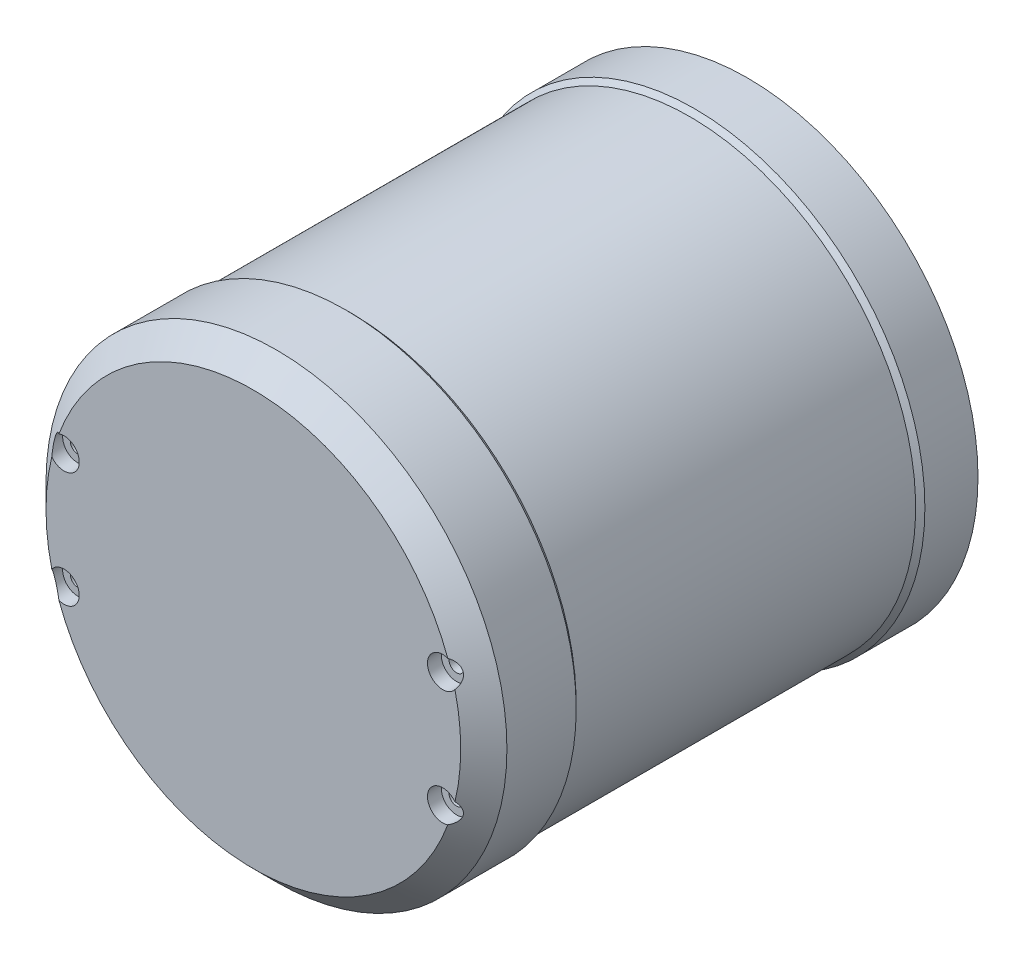
ISO-10303-21;
HEADER;
FILE_DESCRIPTION(('STEP AP214'),'2;1');
FILE_NAME('part.step','',(''),(''),'','','');
FILE_SCHEMA(('AUTOMOTIVE_DESIGN { 1 0 10303 214 1 1 1 1 }'));
ENDSEC;
DATA;
#1=APPLICATION_CONTEXT('core data for automotive mechanical design processes');
#2=APPLICATION_PROTOCOL_DEFINITION('international standard','automotive_design',2000,#1);
#3=PRODUCT_CONTEXT('',#1,'mechanical');
#4=PRODUCT('Part','Part','',(#3));
#5=PRODUCT_RELATED_PRODUCT_CATEGORY('part','',(#4));
#6=PRODUCT_DEFINITION_FORMATION('','',#4);
#7=PRODUCT_DEFINITION_CONTEXT('part definition',#1,'design');
#8=PRODUCT_DEFINITION('design','',#6,#7);
#9=PRODUCT_DEFINITION_SHAPE('','',#8);
#10=(LENGTH_UNIT() NAMED_UNIT(*) SI_UNIT(.MILLI.,.METRE.));
#11=(NAMED_UNIT(*) PLANE_ANGLE_UNIT() SI_UNIT($,.RADIAN.));
#12=(NAMED_UNIT(*) SI_UNIT($,.STERADIAN.) SOLID_ANGLE_UNIT());
#13=UNCERTAINTY_MEASURE_WITH_UNIT(LENGTH_MEASURE(1.E-05),#10,'distance_accuracy_value','');
#14=(GEOMETRIC_REPRESENTATION_CONTEXT(3) GLOBAL_UNCERTAINTY_ASSIGNED_CONTEXT((#13)) GLOBAL_UNIT_ASSIGNED_CONTEXT((#10,
#11,#12)) REPRESENTATION_CONTEXT('',''));
#15=CARTESIAN_POINT('',(0.,0.,0.));
#16=DIRECTION('',(0.,0.,1.));
#17=DIRECTION('',(1.,0.,0.));
#18=AXIS2_PLACEMENT_3D('',#15,#16,#17);
#19=CARTESIAN_POINT('',(3.10934870199998E-13,55.,-241.138513524835));
#20=DIRECTION('',(0.,0.,1.));
#21=DIRECTION('',(1.,0.,0.));
#22=AXIS2_PLACEMENT_3D('',#19,#20,#21);
#23=CYLINDRICAL_SURFACE('',#22,49.9);
#24=CARTESIAN_POINT('',(0.,55.,-13.));
#25=DIRECTION('',(0.,0.,-1.));
#26=DIRECTION('',(-1.,0.,0.));
#27=AXIS2_PLACEMENT_3D('',#24,#25,#26);
#28=CIRCLE('',#27,49.9);
#29=CARTESIAN_POINT('',(-49.9,55.,-13.));
#30=VERTEX_POINT('',#29);
#31=EDGE_CURVE('E183',#30,#30,#28,.T.);
#32=ORIENTED_EDGE('',*,*,#31,.F.);
#33=EDGE_LOOP('',(#32));
#34=FACE_BOUND('',#33,.T.);
#35=CARTESIAN_POINT('',(3.10934870199998E-13,55.,1.99999999999997));
#36=DIRECTION('',(0.,0.,1.));
#37=DIRECTION('',(1.,0.,0.));
#38=AXIS2_PLACEMENT_3D('',#35,#36,#37);
#39=CIRCLE('',#38,49.9);
#40=CARTESIAN_POINT('',(49.9000000000003,55.,1.99999999999997));
#41=VERTEX_POINT('',#40);
#42=EDGE_CURVE('E299',#41,#41,#39,.F.);
#43=ORIENTED_EDGE('',*,*,#42,.T.);
#44=EDGE_LOOP('',(#43));
#45=FACE_BOUND('',#44,.T.);
#46=ADVANCED_FACE('F41',(#34,#45),#23,.T.);
#47=CARTESIAN_POINT('',(41.0000000000002,67.5,7.));
#48=DIRECTION('',(0.,0.,-1.));
#49=DIRECTION('',(-1.,0.,0.));
#50=AXIS2_PLACEMENT_3D('',#47,#48,#49);
#51=CYLINDRICAL_SURFACE('',#50,1.65);
#52=CARTESIAN_POINT('',(41.0000000000002,67.5,0.));
#53=DIRECTION('',(0.,0.,1.));
#54=DIRECTION('',(1.,0.,0.));
#55=AXIS2_PLACEMENT_3D('',#52,#53,#54);
#56=CIRCLE('',#55,1.65);
#57=CARTESIAN_POINT('',(42.6500000000002,67.5,0.));
#58=VERTEX_POINT('',#57);
#59=EDGE_CURVE('E221',#58,#58,#56,.T.);
#60=ORIENTED_EDGE('',*,*,#59,.F.);
#61=EDGE_LOOP('',(#60));
#62=FACE_BOUND('',#61,.T.);
#63=CARTESIAN_POINT('',(41.0000000000002,67.5,4.));
#64=DIRECTION('',(0.,0.,1.));
#65=DIRECTION('',(1.,0.,0.));
#66=AXIS2_PLACEMENT_3D('',#63,#64,#65);
#67=CIRCLE('',#66,1.65);
#68=CARTESIAN_POINT('',(42.6500000000002,67.5,4.));
#69=VERTEX_POINT('',#68);
#70=EDGE_CURVE('E215',#69,#69,#67,.T.);
#71=ORIENTED_EDGE('',*,*,#70,.T.);
#72=EDGE_LOOP('',(#71));
#73=FACE_BOUND('',#72,.T.);
#74=ADVANCED_FACE('F318',(#62,#73),#51,.F.);
#75=CARTESIAN_POINT('',(41.0000000000002,42.5,7.));
#76=DIRECTION('',(0.,0.,-1.));
#77=DIRECTION('',(-1.,0.,0.));
#78=AXIS2_PLACEMENT_3D('',#75,#76,#77);
#79=CYLINDRICAL_SURFACE('',#78,1.65);
#80=CARTESIAN_POINT('',(41.0000000000002,42.5,0.));
#81=DIRECTION('',(0.,0.,1.));
#82=DIRECTION('',(1.,0.,0.));
#83=AXIS2_PLACEMENT_3D('',#80,#81,#82);
#84=CIRCLE('',#83,1.65);
#85=CARTESIAN_POINT('',(42.6500000000002,42.5,0.));
#86=VERTEX_POINT('',#85);
#87=EDGE_CURVE('E218',#86,#86,#84,.T.);
#88=ORIENTED_EDGE('',*,*,#87,.F.);
#89=EDGE_LOOP('',(#88));
#90=FACE_BOUND('',#89,.T.);
#91=CARTESIAN_POINT('',(41.0000000000002,42.5,4.));
#92=DIRECTION('',(0.,0.,1.));
#93=DIRECTION('',(1.,0.,0.));
#94=AXIS2_PLACEMENT_3D('',#91,#92,#93);
#95=CIRCLE('',#94,1.65);
#96=CARTESIAN_POINT('',(42.6500000000002,42.5,4.));
#97=VERTEX_POINT('',#96);
#98=EDGE_CURVE('E239',#97,#97,#95,.T.);
#99=ORIENTED_EDGE('',*,*,#98,.T.);
#100=EDGE_LOOP('',(#99));
#101=FACE_BOUND('',#100,.T.);
#102=ADVANCED_FACE('F314',(#90,#101),#79,.F.);
#103=CARTESIAN_POINT('',(-40.9999999999998,67.5,7.));
#104=DIRECTION('',(0.,0.,-1.));
#105=DIRECTION('',(-1.,0.,0.));
#106=AXIS2_PLACEMENT_3D('',#103,#104,#105);
#107=CYLINDRICAL_SURFACE('',#106,1.65);
#108=CARTESIAN_POINT('',(-40.9999999999998,67.5,0.));
#109=DIRECTION('',(0.,0.,1.));
#110=DIRECTION('',(1.,0.,0.));
#111=AXIS2_PLACEMENT_3D('',#108,#109,#110);
#112=CIRCLE('',#111,1.65);
#113=CARTESIAN_POINT('',(-39.3499999999998,67.5,0.));
#114=VERTEX_POINT('',#113);
#115=EDGE_CURVE('E214',#114,#114,#112,.T.);
#116=ORIENTED_EDGE('',*,*,#115,.F.);
#117=EDGE_LOOP('',(#116));
#118=FACE_BOUND('',#117,.T.);
#119=CARTESIAN_POINT('',(-40.9999999999998,67.5,4.));
#120=DIRECTION('',(0.,0.,1.));
#121=DIRECTION('',(1.,0.,0.));
#122=AXIS2_PLACEMENT_3D('',#119,#120,#121);
#123=CIRCLE('',#122,1.65);
#124=CARTESIAN_POINT('',(-39.3499999999998,67.5,4.));
#125=VERTEX_POINT('',#124);
#126=EDGE_CURVE('E236',#125,#125,#123,.T.);
#127=ORIENTED_EDGE('',*,*,#126,.T.);
#128=EDGE_LOOP('',(#127));
#129=FACE_BOUND('',#128,.T.);
#130=ADVANCED_FACE('F310',(#118,#129),#107,.F.);
#131=CARTESIAN_POINT('',(-40.9999999999998,42.5,7.));
#132=DIRECTION('',(0.,0.,-1.));
#133=DIRECTION('',(-1.,0.,0.));
#134=AXIS2_PLACEMENT_3D('',#131,#132,#133);
#135=CYLINDRICAL_SURFACE('',#134,1.65);
#136=CARTESIAN_POINT('',(-40.9999999999998,42.5,0.));
#137=DIRECTION('',(0.,0.,1.));
#138=DIRECTION('',(1.,0.,0.));
#139=AXIS2_PLACEMENT_3D('',#136,#137,#138);
#140=CIRCLE('',#139,1.65);
#141=CARTESIAN_POINT('',(-39.3499999999998,42.5,0.));
#142=VERTEX_POINT('',#141);
#143=EDGE_CURVE('E211',#142,#142,#140,.T.);
#144=ORIENTED_EDGE('',*,*,#143,.F.);
#145=EDGE_LOOP('',(#144));
#146=FACE_BOUND('',#145,.T.);
#147=CARTESIAN_POINT('',(-40.9999999999998,42.5,4.));
#148=DIRECTION('',(0.,0.,1.));
#149=DIRECTION('',(1.,0.,0.));
#150=AXIS2_PLACEMENT_3D('',#147,#148,#149);
#151=CIRCLE('',#150,1.65);
#152=CARTESIAN_POINT('',(-39.3499999999998,42.5,4.));
#153=VERTEX_POINT('',#152);
#154=EDGE_CURVE('E208',#153,#153,#151,.T.);
#155=ORIENTED_EDGE('',*,*,#154,.T.);
#156=EDGE_LOOP('',(#155));
#157=FACE_BOUND('',#156,.T.);
#158=ADVANCED_FACE('F306',(#146,#157),#135,.F.);
#159=CARTESIAN_POINT('',(0.,55.,-88.5000000000004));
#160=DIRECTION('',(0.,0.,-1.));
#161=DIRECTION('',(-1.,0.,0.));
#162=AXIS2_PLACEMENT_3D('',#159,#160,#161);
#163=CIRCLE('',#162,49.9);
#164=CARTESIAN_POINT('',(-49.9,55.,-88.5000000000004));
#165=VERTEX_POINT('',#164);
#166=EDGE_CURVE('E174',#165,#165,#163,.T.);
#167=ORIENTED_EDGE('',*,*,#166,.T.);
#168=EDGE_LOOP('',(#167));
#169=FACE_BOUND('',#168,.T.);
#170=CARTESIAN_POINT('',(3.10934870199998E-13,55.,-100.));
#171=DIRECTION('',(0.,0.,1.));
#172=DIRECTION('',(1.,0.,0.));
#173=AXIS2_PLACEMENT_3D('',#170,#171,#172);
#174=CIRCLE('',#173,49.9);
#175=CARTESIAN_POINT('',(49.9000000000003,55.,-100.));
#176=VERTEX_POINT('',#175);
#177=EDGE_CURVE('E225',#176,#176,#174,.F.);
#178=ORIENTED_EDGE('',*,*,#177,.F.);
#179=EDGE_LOOP('',(#178));
#180=FACE_BOUND('',#179,.T.);
#181=ADVANCED_FACE('F309',(#169,#180),#23,.T.);
#182=CARTESIAN_POINT('',(3.05311331771918E-13,55.,-241.138513524835));
#183=DIRECTION('',(0.,0.,1.));
#184=DIRECTION('',(1.,0.,0.));
#185=AXIS2_PLACEMENT_3D('',#182,#183,#184);
#186=CYLINDRICAL_SURFACE('',#185,47.5);
#187=CARTESIAN_POINT('',(3.05311331771918E-13,55.,-100.));
#188=DIRECTION('',(0.,0.,1.));
#189=DIRECTION('',(1.,0.,0.));
#190=AXIS2_PLACEMENT_3D('',#187,#188,#189);
#191=CIRCLE('',#190,47.5);
#192=CARTESIAN_POINT('',(-45.7421177541288,67.8026818818318,-100.));
#193=VERTEX_POINT('',#192);
#194=CARTESIAN_POINT('',(45.7421177541294,67.8026818818317,-100.));
#195=VERTEX_POINT('',#194);
#196=EDGE_CURVE('E233',#193,#195,#191,.F.);
#197=ORIENTED_EDGE('',*,*,#196,.T.);
#198=DIRECTION('',(0.,0.,-1.));
#199=VECTOR('',#198,1.);
#200=CARTESIAN_POINT('',(45.7421177541294,67.8026818818317,-96.));
#201=LINE('',#200,#199);
#202=CARTESIAN_POINT('',(45.7421177541294,67.8026818818317,-92.));
#203=VERTEX_POINT('',#202);
#204=EDGE_CURVE('E58',#195,#203,#201,.F.);
#205=ORIENTED_EDGE('',*,*,#204,.T.);
#206=CARTESIAN_POINT('',(3.05311331771918E-13,55.,-92.));
#207=DIRECTION('',(0.,0.,-1.));
#208=DIRECTION('',(-1.,0.,0.));
#209=AXIS2_PLACEMENT_3D('',#206,#207,#208);
#210=CIRCLE('',#209,47.5);
#211=CARTESIAN_POINT('',(46.7823616171874,63.2256088843765,-92.));
#212=VERTEX_POINT('',#211);
#213=EDGE_CURVE('E11',#212,#203,#210,.F.);
#214=ORIENTED_EDGE('',*,*,#213,.F.);
#215=DIRECTION('',(0.,0.,-1.));
#216=VECTOR('',#215,1.);
#217=CARTESIAN_POINT('',(46.7823616171874,63.2256088843764,-96.));
#218=LINE('',#217,#216);
#219=CARTESIAN_POINT('',(46.7823616171874,63.2256088843764,-100.));
#220=VERTEX_POINT('',#219);
#221=EDGE_CURVE('E171',#212,#220,#218,.T.);
#222=ORIENTED_EDGE('',*,*,#221,.T.);
#223=CARTESIAN_POINT('',(46.7823616171874,46.7743911156235,-100.));
#224=VERTEX_POINT('',#223);
#225=EDGE_CURVE('E156',#220,#224,#191,.F.);
#226=ORIENTED_EDGE('',*,*,#225,.T.);
#227=DIRECTION('',(0.,0.,-1.));
#228=VECTOR('',#227,1.);
#229=CARTESIAN_POINT('',(46.7823616171874,46.7743911156235,-96.));
#230=LINE('',#229,#228);
#231=CARTESIAN_POINT('',(46.7823616171874,46.7743911156235,-92.));
#232=VERTEX_POINT('',#231);
#233=EDGE_CURVE('E145',#224,#232,#230,.F.);
#234=ORIENTED_EDGE('',*,*,#233,.T.);
#235=CARTESIAN_POINT('',(3.05311331771918E-13,55.,-92.));
#236=DIRECTION('',(0.,0.,-1.));
#237=DIRECTION('',(-1.,0.,0.));
#238=AXIS2_PLACEMENT_3D('',#235,#236,#237);
#239=CIRCLE('',#238,47.5);
#240=CARTESIAN_POINT('',(45.7421177541294,42.1973181181682,-92.));
#241=VERTEX_POINT('',#240);
#242=EDGE_CURVE('E133',#241,#232,#239,.F.);
#243=ORIENTED_EDGE('',*,*,#242,.F.);
#244=DIRECTION('',(0.,0.,-1.));
#245=VECTOR('',#244,1.);
#246=CARTESIAN_POINT('',(45.7421177541294,42.1973181181682,-96.));
#247=LINE('',#246,#245);
#248=CARTESIAN_POINT('',(45.7421177541294,42.1973181181682,-100.));
#249=VERTEX_POINT('',#248);
#250=EDGE_CURVE('E147',#241,#249,#247,.T.);
#251=ORIENTED_EDGE('',*,*,#250,.T.);
#252=CARTESIAN_POINT('',(-45.7421177541288,42.1973181181681,-100.));
#253=VERTEX_POINT('',#252);
#254=EDGE_CURVE('E229',#249,#253,#191,.F.);
#255=ORIENTED_EDGE('',*,*,#254,.T.);
#256=DIRECTION('',(0.,0.,-1.));
#257=VECTOR('',#256,1.);
#258=CARTESIAN_POINT('',(-45.7421177541288,42.1973181181682,-96.));
#259=LINE('',#258,#257);
#260=CARTESIAN_POINT('',(-45.7421177541288,42.1973181181682,-92.));
#261=VERTEX_POINT('',#260);
#262=EDGE_CURVE('E168',#253,#261,#259,.F.);
#263=ORIENTED_EDGE('',*,*,#262,.T.);
#264=CARTESIAN_POINT('',(3.05311331771918E-13,55.,-92.));
#265=DIRECTION('',(0.,0.,-1.));
#266=DIRECTION('',(-1.,0.,0.));
#267=AXIS2_PLACEMENT_3D('',#264,#265,#266);
#268=CIRCLE('',#267,47.5);
#269=CARTESIAN_POINT('',(-46.7823616171868,46.7743911156236,-92.));
#270=VERTEX_POINT('',#269);
#271=EDGE_CURVE('E51',#270,#261,#268,.F.);
#272=ORIENTED_EDGE('',*,*,#271,.F.);
#273=DIRECTION('',(0.,0.,-1.));
#274=VECTOR('',#273,1.);
#275=CARTESIAN_POINT('',(-46.7823616171868,46.7743911156236,-96.));
#276=LINE('',#275,#274);
#277=CARTESIAN_POINT('',(-46.7823616171868,46.7743911156236,-100.));
#278=VERTEX_POINT('',#277);
#279=EDGE_CURVE('E165',#270,#278,#276,.T.);
#280=ORIENTED_EDGE('',*,*,#279,.T.);
#281=CARTESIAN_POINT('',(-46.7823616171869,63.2256088843763,-100.));
#282=VERTEX_POINT('',#281);
#283=EDGE_CURVE('E370',#278,#282,#191,.F.);
#284=ORIENTED_EDGE('',*,*,#283,.T.);
#285=DIRECTION('',(0.,0.,-1.));
#286=VECTOR('',#285,1.);
#287=CARTESIAN_POINT('',(-46.7823616171868,63.2256088843763,-96.));
#288=LINE('',#287,#286);
#289=CARTESIAN_POINT('',(-46.7823616171868,63.2256088843764,-92.));
#290=VERTEX_POINT('',#289);
#291=EDGE_CURVE('E66',#282,#290,#288,.F.);
#292=ORIENTED_EDGE('',*,*,#291,.T.);
#293=CARTESIAN_POINT('',(3.05311331771918E-13,55.,-92.));
#294=DIRECTION('',(0.,0.,-1.));
#295=DIRECTION('',(-1.,0.,0.));
#296=AXIS2_PLACEMENT_3D('',#293,#294,#295);
#297=CIRCLE('',#296,47.5);
#298=CARTESIAN_POINT('',(-45.7421177541288,67.8026818818317,-92.));
#299=VERTEX_POINT('',#298);
#300=EDGE_CURVE('E140',#299,#290,#297,.F.);
#301=ORIENTED_EDGE('',*,*,#300,.F.);
#302=DIRECTION('',(0.,0.,-1.));
#303=VECTOR('',#302,1.);
#304=CARTESIAN_POINT('',(-45.7421177541288,67.8026818818318,-96.));
#305=LINE('',#304,#303);
#306=EDGE_CURVE('E157',#299,#193,#305,.T.);
#307=ORIENTED_EDGE('',*,*,#306,.T.);
#308=EDGE_LOOP('',(#197,#205,#214,#222,#226,#234,#243,#251,#255,#263,#272,#280,#284,#292,#301,#307));
#309=FACE_BOUND('',#308,.T.);
#310=CARTESIAN_POINT('',(3.05311331771918E-13,55.,0.));
#311=DIRECTION('',(0.,0.,1.));
#312=DIRECTION('',(1.,0.,0.));
#313=AXIS2_PLACEMENT_3D('',#310,#311,#312);
#314=CIRCLE('',#313,47.5);
#315=CARTESIAN_POINT('',(47.5000000000003,55.,0.));
#316=VERTEX_POINT('',#315);
#317=EDGE_CURVE('E224',#316,#316,#314,.T.);
#318=ORIENTED_EDGE('',*,*,#317,.T.);
#319=EDGE_LOOP('',(#318));
#320=FACE_BOUND('',#319,.T.);
#321=ADVANCED_FACE('F152',(#309,#320),#186,.F.);
#322=CARTESIAN_POINT('',(2.69195530942386E-13,55.,-100.));
#323=DIRECTION('',(0.,0.,1.));
#324=DIRECTION('',(1.,0.,0.));
#325=AXIS2_PLACEMENT_3D('',#322,#323,#324);
#326=PLANE('',#325);
#327=ORIENTED_EDGE('',*,*,#177,.T.);
#328=EDGE_LOOP('',(#327));
#329=FACE_BOUND('',#328,.T.);
#330=ORIENTED_EDGE('',*,*,#225,.F.);
#331=CARTESIAN_POINT('',(44.0000000000003,65.,-100.));
#332=DIRECTION('',(0.,0.,-1.));
#333=DIRECTION('',(-1.,0.,0.));
#334=AXIS2_PLACEMENT_3D('',#331,#332,#333);
#335=CIRCLE('',#334,3.3);
#336=EDGE_CURVE('E373',#195,#220,#335,.T.);
#337=ORIENTED_EDGE('',*,*,#336,.F.);
#338=ORIENTED_EDGE('',*,*,#196,.F.);
#339=CARTESIAN_POINT('',(-43.9999999999997,65.,-100.));
#340=DIRECTION('',(0.,0.,1.));
#341=DIRECTION('',(1.,0.,0.));
#342=AXIS2_PLACEMENT_3D('',#339,#340,#341);
#343=CIRCLE('',#342,3.3);
#344=EDGE_CURVE('E349',#193,#282,#343,.T.);
#345=ORIENTED_EDGE('',*,*,#344,.T.);
#346=ORIENTED_EDGE('',*,*,#283,.F.);
#347=CARTESIAN_POINT('',(-43.9999999999997,45.,-100.));
#348=DIRECTION('',(0.,0.,1.));
#349=DIRECTION('',(1.,0.,0.));
#350=AXIS2_PLACEMENT_3D('',#347,#348,#349);
#351=CIRCLE('',#350,3.3);
#352=EDGE_CURVE('E141',#278,#253,#351,.T.);
#353=ORIENTED_EDGE('',*,*,#352,.T.);
#354=ORIENTED_EDGE('',*,*,#254,.F.);
#355=CARTESIAN_POINT('',(44.0000000000003,45.,-100.));
#356=DIRECTION('',(0.,0.,-1.));
#357=DIRECTION('',(-1.,0.,0.));
#358=AXIS2_PLACEMENT_3D('',#355,#356,#357);
#359=CIRCLE('',#358,3.3);
#360=EDGE_CURVE('E148',#224,#249,#359,.T.);
#361=ORIENTED_EDGE('',*,*,#360,.F.);
#362=EDGE_LOOP('',(#330,#337,#338,#345,#346,#353,#354,#361));
#363=FACE_BOUND('',#362,.T.);
#364=ADVANCED_FACE('F329',(#329,#363),#326,.F.);
#365=CARTESIAN_POINT('',(3.10934870199998E-13,55.,0.));
#366=DIRECTION('',(0.,0.,1.));
#367=DIRECTION('',(1.,0.,0.));
#368=AXIS2_PLACEMENT_3D('',#365,#366,#367);
#369=PLANE('',#368);
#370=ORIENTED_EDGE('',*,*,#143,.T.);
#371=EDGE_LOOP('',(#370));
#372=FACE_BOUND('',#371,.T.);
#373=ORIENTED_EDGE('',*,*,#115,.T.);
#374=EDGE_LOOP('',(#373));
#375=FACE_BOUND('',#374,.T.);
#376=ORIENTED_EDGE('',*,*,#87,.T.);
#377=EDGE_LOOP('',(#376));
#378=FACE_BOUND('',#377,.T.);
#379=ORIENTED_EDGE('',*,*,#59,.T.);
#380=EDGE_LOOP('',(#379));
#381=FACE_BOUND('',#380,.T.);
#382=ORIENTED_EDGE('',*,*,#317,.F.);
#383=EDGE_LOOP('',(#382));
#384=FACE_BOUND('',#383,.T.);
#385=ADVANCED_FACE('F325',(#372,#375,#378,#381,#384),#369,.F.);
#386=CARTESIAN_POINT('',(3.10934870199998E-13,55.,7.));
#387=DIRECTION('',(0.,0.,1.));
#388=DIRECTION('',(1.,0.,0.));
#389=AXIS2_PLACEMENT_3D('',#386,#387,#388);
#390=PLANE('',#389);
#391=CARTESIAN_POINT('',(-40.9999999999998,67.5,7.));
#392=DIRECTION('',(0.,0.,1.));
#393=DIRECTION('',(1.,0.,0.));
#394=AXIS2_PLACEMENT_3D('',#391,#392,#393);
#395=CIRCLE('',#394,3.3);
#396=CARTESIAN_POINT('',(-43.6477076827145,65.5303188006955,7.));
#397=VERTEX_POINT('',#396);
#398=CARTESIAN_POINT('',(-42.0984727499969,70.6118093800093,7.));
#399=VERTEX_POINT('',#398);
#400=EDGE_CURVE('E196',#397,#399,#395,.T.);
#401=ORIENTED_EDGE('',*,*,#400,.F.);
#402=CARTESIAN_POINT('',(3.10934870199998E-13,55.,7.));
#403=DIRECTION('',(0.,0.,1.));
#404=DIRECTION('',(1.,0.,0.));
#405=AXIS2_PLACEMENT_3D('',#402,#403,#404);
#406=CIRCLE('',#405,44.9);
#407=CARTESIAN_POINT('',(-43.6477076827145,44.4696811993044,7.));
#408=VERTEX_POINT('',#407);
#409=EDGE_CURVE('E249',#397,#408,#406,.T.);
#410=ORIENTED_EDGE('',*,*,#409,.T.);
#411=CARTESIAN_POINT('',(-40.9999999999998,42.5,7.));
#412=DIRECTION('',(0.,0.,1.));
#413=DIRECTION('',(1.,0.,0.));
#414=AXIS2_PLACEMENT_3D('',#411,#412,#413);
#415=CIRCLE('',#414,3.3);
#416=CARTESIAN_POINT('',(-42.0984727499969,39.3881906199907,7.));
#417=VERTEX_POINT('',#416);
#418=EDGE_CURVE('E193',#417,#408,#415,.T.);
#419=ORIENTED_EDGE('',*,*,#418,.F.);
#420=CARTESIAN_POINT('',(3.10934870199998E-13,55.,7.));
#421=DIRECTION('',(0.,0.,1.));
#422=DIRECTION('',(1.,0.,0.));
#423=AXIS2_PLACEMENT_3D('',#420,#421,#422);
#424=CIRCLE('',#423,44.9);
#425=CARTESIAN_POINT('',(42.0984727499975,39.3881906199908,7.));
#426=VERTEX_POINT('',#425);
#427=EDGE_CURVE('E247',#417,#426,#424,.T.);
#428=ORIENTED_EDGE('',*,*,#427,.T.);
#429=CARTESIAN_POINT('',(41.0000000000002,42.5,7.));
#430=DIRECTION('',(0.,0.,1.));
#431=DIRECTION('',(1.,0.,0.));
#432=AXIS2_PLACEMENT_3D('',#429,#430,#431);
#433=CIRCLE('',#432,3.3);
#434=CARTESIAN_POINT('',(43.6477076827151,44.4696811993043,7.));
#435=VERTEX_POINT('',#434);
#436=EDGE_CURVE('E187',#435,#426,#433,.T.);
#437=ORIENTED_EDGE('',*,*,#436,.F.);
#438=CARTESIAN_POINT('',(3.10934870199998E-13,55.,7.));
#439=DIRECTION('',(0.,0.,1.));
#440=DIRECTION('',(1.,0.,0.));
#441=AXIS2_PLACEMENT_3D('',#438,#439,#440);
#442=CIRCLE('',#441,44.9);
#443=CARTESIAN_POINT('',(43.6477076827151,65.5303188006957,7.));
#444=VERTEX_POINT('',#443);
#445=EDGE_CURVE('E245',#435,#444,#442,.T.);
#446=ORIENTED_EDGE('',*,*,#445,.T.);
#447=CARTESIAN_POINT('',(41.0000000000002,67.5,7.));
#448=DIRECTION('',(0.,0.,1.));
#449=DIRECTION('',(1.,0.,0.));
#450=AXIS2_PLACEMENT_3D('',#447,#448,#449);
#451=CIRCLE('',#450,3.3);
#452=CARTESIAN_POINT('',(42.0984727499975,70.6118093800092,7.));
#453=VERTEX_POINT('',#452);
#454=EDGE_CURVE('E200',#453,#444,#451,.T.);
#455=ORIENTED_EDGE('',*,*,#454,.F.);
#456=CARTESIAN_POINT('',(3.10934870199998E-13,55.,7.));
#457=DIRECTION('',(0.,0.,1.));
#458=DIRECTION('',(1.,0.,0.));
#459=AXIS2_PLACEMENT_3D('',#456,#457,#458);
#460=CIRCLE('',#459,44.9);
#461=EDGE_CURVE('E228',#453,#399,#460,.T.);
#462=ORIENTED_EDGE('',*,*,#461,.T.);
#463=EDGE_LOOP('',(#401,#410,#419,#428,#437,#446,#455,#462));
#464=FACE_BOUND('',#463,.T.);
#465=ADVANCED_FACE('F272',(#464),#390,.T.);
#466=CARTESIAN_POINT('',(-40.9999999999998,42.5,4.));
#467=DIRECTION('',(0.,0.,1.));
#468=DIRECTION('',(1.,0.,0.));
#469=AXIS2_PLACEMENT_3D('',#466,#467,#468);
#470=CYLINDRICAL_SURFACE('',#469,3.3);
#471=CARTESIAN_POINT('',(-40.9999999999998,42.5,4.));
#472=DIRECTION('',(0.,0.,1.));
#473=DIRECTION('',(1.,0.,0.));
#474=AXIS2_PLACEMENT_3D('',#471,#472,#473);
#475=CIRCLE('',#474,3.3);
#476=CARTESIAN_POINT('',(-37.6999999999998,42.5,4.));
#477=VERTEX_POINT('',#476);
#478=EDGE_CURVE('E197',#477,#477,#475,.T.);
#479=ORIENTED_EDGE('',*,*,#478,.F.);
#480=EDGE_LOOP('',(#479));
#481=FACE_BOUND('',#480,.T.);
#482=ORIENTED_EDGE('',*,*,#418,.T.);
#483=CARTESIAN_POINT('',(-43.6477076827145,44.4696811993044,7.));
#484=CARTESIAN_POINT('',(-43.7495672420593,44.332771437666,6.86884838580529));
#485=CARTESIAN_POINT('',(-43.8436146615561,44.1841091865539,6.74218252456732));
#486=CARTESIAN_POINT('',(-44.0107298107619,43.8632920647223,6.50229626362643));
#487=CARTESIAN_POINT('',(-44.0835963474043,43.690933443847,6.389210435826));
#488=CARTESIAN_POINT('',(-44.1870583666546,43.3684240839481,6.20782905736377));
#489=CARTESIAN_POINT('',(-44.2235701378326,43.2226221886263,6.13526001191471));
#490=CARTESIAN_POINT('',(-44.2765807408333,42.9210732537811,6.00558893351853));
#491=CARTESIAN_POINT('',(-44.2931393950114,42.7653574232136,5.94844106749442));
#492=CARTESIAN_POINT('',(-44.3008786789816,42.5262424890292,5.87656493881023));
#493=CARTESIAN_POINT('',(-44.3005562671574,42.4451293398381,5.85482927723326));
#494=CARTESIAN_POINT('',(-44.2937985283752,42.2819515435366,5.81656418658498));
#495=CARTESIAN_POINT('',(-44.2873664932168,42.1998874323124,5.8000319603442));
#496=CARTESIAN_POINT('',(-44.2682000758106,42.0355558430766,5.7725276899603));
#497=CARTESIAN_POINT('',(-44.2554658761399,41.9532883710252,5.76155548475899));
#498=CARTESIAN_POINT('',(-44.223675099596,41.7894398954155,5.74541819851301));
#499=CARTESIAN_POINT('',(-44.2046196156939,41.7078587756832,5.74025211424779));
#500=CARTESIAN_POINT('',(-44.1446748227653,41.489404529868,5.73433886052687));
#501=CARTESIAN_POINT('',(-44.0978484989276,41.3539164456678,5.73923895226265));
#502=CARTESIAN_POINT('',(-43.9878005920369,41.0917000425158,5.76598532065247));
#503=CARTESIAN_POINT('',(-43.9245819973519,40.9649701322463,5.78782850996484));
#504=CARTESIAN_POINT('',(-43.7867446041094,40.7273465130041,5.84600778410034));
#505=CARTESIAN_POINT('',(-43.7125715739861,40.6160678747288,5.88184108291707));
#506=CARTESIAN_POINT('',(-43.5541338836833,40.4062677796895,5.96609035779867));
#507=CARTESIAN_POINT('',(-43.4698655183843,40.3077510344859,6.0145109612431));
#508=CARTESIAN_POINT('',(-43.2587243840852,40.087578064744,6.14334409817269));
#509=CARTESIAN_POINT('',(-43.1282505486281,39.9723336684136,6.22881751595606));
#510=CARTESIAN_POINT('',(-42.8583488384151,39.7677209156769,6.4154938505275));
#511=CARTESIAN_POINT('',(-42.718901078225,39.6784126248572,6.51673245877191));
#512=CARTESIAN_POINT('',(-42.4982850764685,39.5583608881268,6.6833665816826));
#513=CARTESIAN_POINT('',(-42.4185821103087,39.519173685633,6.74484143057011));
#514=CARTESIAN_POINT('',(-42.2587997277376,39.4482790119242,6.87047036513607));
#515=CARTESIAN_POINT('',(-42.1787251905483,39.4165293977322,6.93460680516908));
#516=CARTESIAN_POINT('',(-42.0984727499969,39.3881906199907,7.));
#517=B_SPLINE_CURVE_WITH_KNOTS('',3,(#483,#484,#485,#486,#487,#488,#489,#490,#491,#492,#493,
#494,#495,#496,#497,#498,#499,#500,#501,#502,#503,#504,#505,#506,#507,#508,#509,#510,#511,#512,
#513,#514,#515,#516),.UNSPECIFIED.,.F.,.F.,(4,2,2,2,2,2,2,2,2,2,2,2,2,2,2,2,4),(0.,
0.646852296226538,1.29966189237209,1.79851644270128,2.29587160306216,2.54747141697096,
2.79893574844681,3.05039279529039,3.30180638701436,3.72969758669091,4.15751083509085,
4.57118656188945,4.98501458088905,5.56366507746906,6.14364517842034,6.46743702912582,
6.78934725527083),.UNSPECIFIED.);
#518=EDGE_CURVE('E252',#408,#417,#517,.T.);
#519=ORIENTED_EDGE('',*,*,#518,.T.);
#520=EDGE_LOOP('',(#482,#519));
#521=FACE_BOUND('',#520,.T.);
#522=ADVANCED_FACE('F266',(#481,#521),#470,.F.);
#523=CARTESIAN_POINT('',(-40.9999999999998,42.5,4.));
#524=DIRECTION('',(0.,0.,1.));
#525=DIRECTION('',(1.,0.,0.));
#526=AXIS2_PLACEMENT_3D('',#523,#524,#525);
#527=PLANE('',#526);
#528=ORIENTED_EDGE('',*,*,#154,.F.);
#529=EDGE_LOOP('',(#528));
#530=FACE_BOUND('',#529,.T.);
#531=ORIENTED_EDGE('',*,*,#478,.T.);
#532=EDGE_LOOP('',(#531));
#533=FACE_BOUND('',#532,.T.);
#534=ADVANCED_FACE('F271',(#530,#533),#527,.T.);
#535=CARTESIAN_POINT('',(-40.9999999999998,67.5,4.));
#536=DIRECTION('',(0.,0.,1.));
#537=DIRECTION('',(1.,0.,0.));
#538=AXIS2_PLACEMENT_3D('',#535,#536,#537);
#539=CYLINDRICAL_SURFACE('',#538,3.3);
#540=CARTESIAN_POINT('',(-40.9999999999998,67.5,4.));
#541=DIRECTION('',(0.,0.,1.));
#542=DIRECTION('',(1.,0.,0.));
#543=AXIS2_PLACEMENT_3D('',#540,#541,#542);
#544=CIRCLE('',#543,3.3);
#545=CARTESIAN_POINT('',(-37.6999999999998,67.5,4.));
#546=VERTEX_POINT('',#545);
#547=EDGE_CURVE('E205',#546,#546,#544,.T.);
#548=ORIENTED_EDGE('',*,*,#547,.F.);
#549=EDGE_LOOP('',(#548));
#550=FACE_BOUND('',#549,.T.);
#551=ORIENTED_EDGE('',*,*,#400,.T.);
#552=CARTESIAN_POINT('',(-42.0984727499969,70.6118093800093,7.));
#553=CARTESIAN_POINT('',(-42.2593887215796,70.5550141095072,6.86884838580529));
#554=CARTESIAN_POINT('',(-42.4203780318355,70.4841069589295,6.74218252456733));
#555=CARTESIAN_POINT('',(-42.7380519323004,70.3110913766317,6.50229626362643));
#556=CARTESIAN_POINT('',(-42.8946832226216,70.2087016054404,6.389210435826));
#557=CARTESIAN_POINT('',(-43.1604749263898,69.9987696001204,6.20782905736377));
#558=CARTESIAN_POINT('',(-43.2721191042689,69.8981372014623,6.13526001191472));
#559=CARTESIAN_POINT('',(-43.4843469312613,69.6774536416149,6.00558893351855));
#560=CARTESIAN_POINT('',(-43.5849628160291,69.5574617558481,5.94844106749443));
#561=CARTESIAN_POINT('',(-43.724787706911,69.3633358993624,5.87656493881024));
#562=CARTESIAN_POINT('',(-43.7697730820596,69.2958395072825,5.85482927723327));
#563=CARTESIAN_POINT('',(-43.8552015098735,69.1566466771492,5.81656418658498));
#564=CARTESIAN_POINT('',(-43.8956469954617,69.0849525203243,5.8000319603442));
#565=CARTESIAN_POINT('',(-43.971421051266,68.9378793574294,5.77252768996031));
#566=CARTESIAN_POINT('',(-44.0067497696793,68.8625004581654,5.761555484759));
#567=CARTESIAN_POINT('',(-44.0717772297226,68.7087851177689,5.74541819851301));
#568=CARTESIAN_POINT('',(-44.1014769432324,68.6304491899902,5.74025211424779));
#569=CARTESIAN_POINT('',(-44.1736036428883,68.4157089401284,5.73433886052688));
#570=CARTESIAN_POINT('',(-44.2103307344837,68.277141821708,5.73923895226266));
#571=CARTESIAN_POINT('',(-44.265291282694,67.9981304921291,5.76598532065247));
#572=CARTESIAN_POINT('',(-44.2835281071763,67.8576866275294,5.78782850996483));
#573=CARTESIAN_POINT('',(-44.3017056248668,67.5835813389117,5.84600778410033));
#574=CARTESIAN_POINT('',(-44.3022310169211,67.4498491524446,5.88184108291705));
#575=CARTESIAN_POINT('',(-44.2877894488852,67.1873419664484,5.96609035779866));
#576=CARTESIAN_POINT('',(-44.2728167853086,67.0585688100022,6.01451096124309));
#577=CARTESIAN_POINT('',(-44.2204231804442,66.7580498831982,6.14334409817269));
#578=CARTESIAN_POINT('',(-44.1764365295397,66.5896163141966,6.22881751595605));
#579=CARTESIAN_POINT('',(-44.0665959737676,66.2692284803669,6.4154938505275));
#580=CARTESIAN_POINT('',(-44.00069205527,66.1173129704351,6.5167324587719));
#581=CARTESIAN_POINT('',(-43.8845776350607,65.8945995196907,6.68336658168259));
#582=CARTESIAN_POINT('',(-43.840293941989,65.8176115064556,6.74484143057011));
#583=CARTESIAN_POINT('',(-43.7472412016032,65.6696329537966,6.87047036513607));
#584=CARTESIAN_POINT('',(-43.6984997151247,65.5986101616571,6.93460680516908));
#585=CARTESIAN_POINT('',(-43.6477076827145,65.5303188006955,7.));
#586=B_SPLINE_CURVE_WITH_KNOTS('',3,(#552,#553,#554,#555,#556,#557,#558,#559,#560,#561,#562,
#563,#564,#565,#566,#567,#568,#569,#570,#571,#572,#573,#574,#575,#576,#577,#578,#579,#580,#581,
#582,#583,#584,#585),.UNSPECIFIED.,.F.,.F.,(4,2,2,2,2,2,2,2,2,2,2,2,2,2,2,2,4),(0.,
0.646852296226529,1.29966189237208,1.79851644270125,2.29587160306213,2.54747141697094,
2.7989357484468,3.05039279529036,3.30180638701434,3.72969758669088,4.15751083509082,
4.5711865618894,4.98501458088902,5.56366507746905,6.14364517842032,6.4674370291258,
6.78934725527082),.UNSPECIFIED.);
#587=EDGE_CURVE('E292',#399,#397,#586,.T.);
#588=ORIENTED_EDGE('',*,*,#587,.T.);
#589=EDGE_LOOP('',(#551,#588));
#590=FACE_BOUND('',#589,.T.);
#591=ADVANCED_FACE('F277',(#550,#590),#539,.F.);
#592=CARTESIAN_POINT('',(-40.9999999999998,67.5,4.));
#593=DIRECTION('',(0.,0.,1.));
#594=DIRECTION('',(1.,0.,0.));
#595=AXIS2_PLACEMENT_3D('',#592,#593,#594);
#596=PLANE('',#595);
#597=ORIENTED_EDGE('',*,*,#126,.F.);
#598=EDGE_LOOP('',(#597));
#599=FACE_BOUND('',#598,.T.);
#600=ORIENTED_EDGE('',*,*,#547,.T.);
#601=EDGE_LOOP('',(#600));
#602=FACE_BOUND('',#601,.T.);
#603=ADVANCED_FACE('F304',(#599,#602),#596,.T.);
#604=CARTESIAN_POINT('',(41.0000000000002,42.5,4.));
#605=DIRECTION('',(0.,0.,1.));
#606=DIRECTION('',(1.,0.,0.));
#607=AXIS2_PLACEMENT_3D('',#604,#605,#606);
#608=CYLINDRICAL_SURFACE('',#607,3.3);
#609=CARTESIAN_POINT('',(41.0000000000002,42.5,4.));
#610=DIRECTION('',(0.,0.,1.));
#611=DIRECTION('',(1.,0.,0.));
#612=AXIS2_PLACEMENT_3D('',#609,#610,#611);
#613=CIRCLE('',#612,3.3);
#614=CARTESIAN_POINT('',(44.3000000000002,42.5,4.));
#615=VERTEX_POINT('',#614);
#616=EDGE_CURVE('E186',#615,#615,#613,.T.);
#617=ORIENTED_EDGE('',*,*,#616,.F.);
#618=EDGE_LOOP('',(#617));
#619=FACE_BOUND('',#618,.T.);
#620=ORIENTED_EDGE('',*,*,#436,.T.);
#621=CARTESIAN_POINT('',(42.0984727499975,39.3881906199908,7.));
#622=CARTESIAN_POINT('',(42.2593887215803,39.4449858904928,6.8688483858053));
#623=CARTESIAN_POINT('',(42.4203780318361,39.5158930410705,6.74218252456734));
#624=CARTESIAN_POINT('',(42.738051932301,39.6889086233684,6.50229626362646));
#625=CARTESIAN_POINT('',(42.8946832226222,39.7912983945597,6.38921043582604));
#626=CARTESIAN_POINT('',(43.1604749263904,40.0012303998797,6.20782905736383));
#627=CARTESIAN_POINT('',(43.2721191042695,40.1018627985377,6.13526001191478));
#628=CARTESIAN_POINT('',(43.4843469312619,40.3225463583851,6.00558893351862));
#629=CARTESIAN_POINT('',(43.5849628160297,40.442538244152,5.94844106749451));
#630=CARTESIAN_POINT('',(43.7247877069116,40.6366641006376,5.87656493881033));
#631=CARTESIAN_POINT('',(43.7697730820602,40.7041604927176,5.85482927723336));
#632=CARTESIAN_POINT('',(43.855201509874,40.8433533228509,5.81656418658508));
#633=CARTESIAN_POINT('',(43.8956469954623,40.9150474796757,5.8000319603443));
#634=CARTESIAN_POINT('',(43.9714210512666,41.0621206425706,5.77252768996041));
#635=CARTESIAN_POINT('',(44.0067497696798,41.1374995418347,5.7615554847591));
#636=CARTESIAN_POINT('',(44.0717772297231,41.2912148822311,5.74541819851313));
#637=CARTESIAN_POINT('',(44.101476943233,41.3695508100098,5.74025211424791));
#638=CARTESIAN_POINT('',(44.1736036428888,41.5842910598716,5.734338860527));
#639=CARTESIAN_POINT('',(44.2103307344843,41.722858178292,5.73923895226278));
#640=CARTESIAN_POINT('',(44.2652912826945,42.001869507871,5.76598532065259));
#641=CARTESIAN_POINT('',(44.2835281071768,42.1423133724706,5.78782850996496));
#642=CARTESIAN_POINT('',(44.3017056248673,42.4164186610884,5.84600778410047));
#643=CARTESIAN_POINT('',(44.3022310169216,42.5501508475555,5.8818410829172));
#644=CARTESIAN_POINT('',(44.2877894488856,42.8126580335516,5.96609035779881));
#645=CARTESIAN_POINT('',(44.2728167853091,42.9414311899978,6.01451096124324));
#646=CARTESIAN_POINT('',(44.2204231804447,43.2419501168018,6.14334409817284));
#647=CARTESIAN_POINT('',(44.1764365295402,43.4103836858034,6.22881751595621));
#648=CARTESIAN_POINT('',(44.0665959737681,43.7307715196331,6.41549385052767));
#649=CARTESIAN_POINT('',(44.0006920552705,43.8826870295649,6.51673245877208));
#650=CARTESIAN_POINT('',(43.8845776350612,44.1054004803093,6.68336658168274));
#651=CARTESIAN_POINT('',(43.8402939419895,44.1823884935443,6.74484143057022));
#652=CARTESIAN_POINT('',(43.7472412016037,44.3303670462033,6.87047036513612));
#653=CARTESIAN_POINT('',(43.6984997151253,44.4013898383428,6.93460680516911));
#654=CARTESIAN_POINT('',(43.6477076827151,44.4696811993043,7.));
#655=B_SPLINE_CURVE_WITH_KNOTS('',3,(#621,#622,#623,#624,#625,#626,#627,#628,#629,#630,#631,
#632,#633,#634,#635,#636,#637,#638,#639,#640,#641,#642,#643,#644,#645,#646,#647,#648,#649,#650,
#651,#652,#653,#654),.UNSPECIFIED.,.F.,.F.,(4,2,2,2,2,2,2,2,2,2,2,2,2,2,2,2,4),(0.,
0.646852296226509,1.29966189237203,1.7985164427012,2.29587160306206,2.54747141697085,
2.79893574844669,3.05039279529025,3.30180638701423,3.72969758669076,4.1575108350907,
4.5711865618893,4.9850145808889,5.56366507746894,6.14364517842022,6.46743702912555,
6.78934725527043),.UNSPECIFIED.);
#656=EDGE_CURVE('E259',#426,#435,#655,.T.);
#657=ORIENTED_EDGE('',*,*,#656,.T.);
#658=EDGE_LOOP('',(#620,#657));
#659=FACE_BOUND('',#658,.T.);
#660=ADVANCED_FACE('F415',(#619,#659),#608,.F.);
#661=CARTESIAN_POINT('',(41.0000000000002,42.5,4.));
#662=DIRECTION('',(0.,0.,1.));
#663=DIRECTION('',(1.,0.,0.));
#664=AXIS2_PLACEMENT_3D('',#661,#662,#663);
#665=PLANE('',#664);
#666=ORIENTED_EDGE('',*,*,#98,.F.);
#667=EDGE_LOOP('',(#666));
#668=FACE_BOUND('',#667,.T.);
#669=ORIENTED_EDGE('',*,*,#616,.T.);
#670=EDGE_LOOP('',(#669));
#671=FACE_BOUND('',#670,.T.);
#672=ADVANCED_FACE('F274',(#668,#671),#665,.T.);
#673=CARTESIAN_POINT('',(41.0000000000002,67.5,4.));
#674=DIRECTION('',(0.,0.,1.));
#675=DIRECTION('',(1.,0.,0.));
#676=AXIS2_PLACEMENT_3D('',#673,#674,#675);
#677=CYLINDRICAL_SURFACE('',#676,3.3);
#678=CARTESIAN_POINT('',(41.0000000000002,67.5,4.));
#679=DIRECTION('',(0.,0.,1.));
#680=DIRECTION('',(1.,0.,0.));
#681=AXIS2_PLACEMENT_3D('',#678,#679,#680);
#682=CIRCLE('',#681,3.3);
#683=CARTESIAN_POINT('',(44.3000000000002,67.5,4.));
#684=VERTEX_POINT('',#683);
#685=EDGE_CURVE('E190',#684,#684,#682,.T.);
#686=ORIENTED_EDGE('',*,*,#685,.F.);
#687=EDGE_LOOP('',(#686));
#688=FACE_BOUND('',#687,.T.);
#689=ORIENTED_EDGE('',*,*,#454,.T.);
#690=CARTESIAN_POINT('',(43.6477076827151,65.5303188006957,7.));
#691=CARTESIAN_POINT('',(43.7495672420598,65.6672285623341,6.86884838580529));
#692=CARTESIAN_POINT('',(43.8436146615566,65.8158908134462,6.74218252456734));
#693=CARTESIAN_POINT('',(44.0107298107625,66.1367079352778,6.50229626362646));
#694=CARTESIAN_POINT('',(44.0835963474048,66.3090665561531,6.38921043582604));
#695=CARTESIAN_POINT('',(44.1870583666552,66.631575916052,6.20782905736382));
#696=CARTESIAN_POINT('',(44.2235701378331,66.7773778113738,6.13526001191476));
#697=CARTESIAN_POINT('',(44.2765807408338,67.078926746219,6.0055889335186));
#698=CARTESIAN_POINT('',(44.2931393950119,67.2346425767865,5.9484410674945));
#699=CARTESIAN_POINT('',(44.3008786789821,67.4737575109709,5.87656493881032));
#700=CARTESIAN_POINT('',(44.3005562671579,67.554870660162,5.85482927723335));
#701=CARTESIAN_POINT('',(44.2937985283757,67.7180484564634,5.81656418658508));
#702=CARTESIAN_POINT('',(44.2873664932173,67.8001125676877,5.8000319603443));
#703=CARTESIAN_POINT('',(44.2682000758111,67.9644441569235,5.77252768996041));
#704=CARTESIAN_POINT('',(44.2554658761403,68.0467116289748,5.76155548475909));
#705=CARTESIAN_POINT('',(44.2236750995964,68.2105601045845,5.74541819851311));
#706=CARTESIAN_POINT('',(44.2046196156943,68.2921412243168,5.7402521142479));
#707=CARTESIAN_POINT('',(44.1446748227658,68.5105954701321,5.734338860527));
#708=CARTESIAN_POINT('',(44.0978484989281,68.6460835543322,5.73923895226278));
#709=CARTESIAN_POINT('',(43.9878005920374,68.9082999574842,5.7659853206526));
#710=CARTESIAN_POINT('',(43.9245819973523,69.0350298677538,5.78782850996497));
#711=CARTESIAN_POINT('',(43.7867446041099,69.2726534869959,5.84600778410047));
#712=CARTESIAN_POINT('',(43.7125715739866,69.3839321252712,5.8818410829172));
#713=CARTESIAN_POINT('',(43.5541338836838,69.5937322203105,5.96609035779881));
#714=CARTESIAN_POINT('',(43.4698655183847,69.6922489655141,6.01451096124325));
#715=CARTESIAN_POINT('',(43.2587243840856,69.912421935256,6.14334409817284));
#716=CARTESIAN_POINT('',(43.1282505486286,70.0276663315865,6.22881751595621));
#717=CARTESIAN_POINT('',(42.8583488384155,70.2322790843231,6.41549385052768));
#718=CARTESIAN_POINT('',(42.7189010782254,70.3215873751428,6.51673245877209));
#719=CARTESIAN_POINT('',(42.4982850764689,70.4416391118732,6.68336658168275));
#720=CARTESIAN_POINT('',(42.4185821103092,70.480826314367,6.74484143057024));
#721=CARTESIAN_POINT('',(42.2587997277381,70.5517209880757,6.87047036513614));
#722=CARTESIAN_POINT('',(42.1787251905489,70.5834706022677,6.93460680516911));
#723=CARTESIAN_POINT('',(42.0984727499975,70.6118093800092,7.));
#724=B_SPLINE_CURVE_WITH_KNOTS('',3,(#690,#691,#692,#693,#694,#695,#696,#697,#698,#699,#700,
#701,#702,#703,#704,#705,#706,#707,#708,#709,#710,#711,#712,#713,#714,#715,#716,#717,#718,#719,
#720,#721,#722,#723),.UNSPECIFIED.,.F.,.F.,(4,2,2,2,2,2,2,2,2,2,2,2,2,2,2,2,4),(0.,
0.646852296226507,1.29966189237205,1.79851644270123,2.29587160306208,2.54747141697087,
2.79893574844673,3.0503927952903,3.30180638701427,3.72969758669082,4.15751083509076,
4.57118656188933,4.98501458088893,5.56366507746896,6.14364517842027,6.46743702912559,
6.78934725527045),.UNSPECIFIED.);
#725=EDGE_CURVE('E286',#444,#453,#724,.T.);
#726=ORIENTED_EDGE('',*,*,#725,.T.);
#727=EDGE_LOOP('',(#689,#726));
#728=FACE_BOUND('',#727,.T.);
#729=ADVANCED_FACE('F279',(#688,#728),#677,.F.);
#730=CARTESIAN_POINT('',(41.0000000000002,67.5,4.));
#731=DIRECTION('',(0.,0.,1.));
#732=DIRECTION('',(1.,0.,0.));
#733=AXIS2_PLACEMENT_3D('',#730,#731,#732);
#734=PLANE('',#733);
#735=ORIENTED_EDGE('',*,*,#70,.F.);
#736=EDGE_LOOP('',(#735));
#737=FACE_BOUND('',#736,.T.);
#738=ORIENTED_EDGE('',*,*,#685,.T.);
#739=EDGE_LOOP('',(#738));
#740=FACE_BOUND('',#739,.T.);
#741=ADVANCED_FACE('F283',(#737,#740),#734,.T.);
#742=CARTESIAN_POINT('',(3.10934870199998E-13,55.,7.00000000000001));
#743=DIRECTION('',(0.,0.,-1.));
#744=DIRECTION('',(-1.,0.,0.));
#745=AXIS2_PLACEMENT_3D('',#742,#743,#744);
#746=CONICAL_SURFACE('',#745,44.9,0.785398163397446);
#747=ORIENTED_EDGE('',*,*,#42,.F.);
#748=EDGE_LOOP('',(#747));
#749=FACE_BOUND('',#748,.T.);
#750=ORIENTED_EDGE('',*,*,#518,.F.);
#751=ORIENTED_EDGE('',*,*,#409,.F.);
#752=ORIENTED_EDGE('',*,*,#587,.F.);
#753=ORIENTED_EDGE('',*,*,#461,.F.);
#754=ORIENTED_EDGE('',*,*,#725,.F.);
#755=ORIENTED_EDGE('',*,*,#445,.F.);
#756=ORIENTED_EDGE('',*,*,#656,.F.);
#757=ORIENTED_EDGE('',*,*,#427,.F.);
#758=EDGE_LOOP('',(#750,#751,#752,#753,#754,#755,#756,#757));
#759=FACE_BOUND('',#758,.T.);
#760=ADVANCED_FACE('F44',(#749,#759),#746,.T.);
#761=CARTESIAN_POINT('',(0.,55.,-13.));
#762=DIRECTION('',(0.,0.,1.));
#763=DIRECTION('',(1.,0.,0.));
#764=AXIS2_PLACEMENT_3D('',#761,#762,#763);
#765=CONICAL_SURFACE('',#764,49.9,0.78539816339745);
#766=CARTESIAN_POINT('',(0.,55.,-14.));
#767=DIRECTION('',(0.,0.,-1.));
#768=DIRECTION('',(-1.,0.,0.));
#769=AXIS2_PLACEMENT_3D('',#766,#767,#768);
#770=CIRCLE('',#769,48.9);
#771=CARTESIAN_POINT('',(-48.9,55.,-14.));
#772=VERTEX_POINT('',#771);
#773=EDGE_CURVE('E180',#772,#772,#770,.T.);
#774=ORIENTED_EDGE('',*,*,#773,.F.);
#775=EDGE_LOOP('',(#774));
#776=FACE_BOUND('',#775,.T.);
#777=ORIENTED_EDGE('',*,*,#31,.T.);
#778=EDGE_LOOP('',(#777));
#779=FACE_BOUND('',#778,.T.);
#780=ADVANCED_FACE('F411',(#776,#779),#765,.T.);
#781=CARTESIAN_POINT('',(0.,55.,1.99999999999997));
#782=DIRECTION('',(0.,0.,-1.));
#783=DIRECTION('',(-1.,0.,0.));
#784=AXIS2_PLACEMENT_3D('',#781,#782,#783);
#785=CYLINDRICAL_SURFACE('',#784,48.9);
#786=CARTESIAN_POINT('',(0.,55.,-87.5000000000004));
#787=DIRECTION('',(0.,0.,-1.));
#788=DIRECTION('',(-1.,0.,0.));
#789=AXIS2_PLACEMENT_3D('',#786,#787,#788);
#790=CIRCLE('',#789,48.9);
#791=CARTESIAN_POINT('',(-48.9,55.,-87.5000000000004));
#792=VERTEX_POINT('',#791);
#793=EDGE_CURVE('E177',#792,#792,#790,.T.);
#794=ORIENTED_EDGE('',*,*,#793,.F.);
#795=EDGE_LOOP('',(#794));
#796=FACE_BOUND('',#795,.T.);
#797=ORIENTED_EDGE('',*,*,#773,.T.);
#798=EDGE_LOOP('',(#797));
#799=FACE_BOUND('',#798,.T.);
#800=ADVANCED_FACE('F407',(#796,#799),#785,.T.);
#801=CARTESIAN_POINT('',(0.,55.,-87.5000000000004));
#802=DIRECTION('',(0.,0.,-1.));
#803=DIRECTION('',(-1.,0.,0.));
#804=AXIS2_PLACEMENT_3D('',#801,#802,#803);
#805=CONICAL_SURFACE('',#804,48.9,0.785398163397448);
#806=ORIENTED_EDGE('',*,*,#166,.F.);
#807=EDGE_LOOP('',(#806));
#808=FACE_BOUND('',#807,.T.);
#809=ORIENTED_EDGE('',*,*,#793,.T.);
#810=EDGE_LOOP('',(#809));
#811=FACE_BOUND('',#810,.T.);
#812=ADVANCED_FACE('F402',(#808,#811),#805,.T.);
#813=CARTESIAN_POINT('',(44.0000000000003,45.,-92.));
#814=DIRECTION('',(0.,0.,-1.));
#815=DIRECTION('',(-1.,0.,0.));
#816=AXIS2_PLACEMENT_3D('',#813,#814,#815);
#817=PLANE('',#816);
#818=ORIENTED_EDGE('',*,*,#242,.T.);
#819=CARTESIAN_POINT('',(44.0000000000003,45.,-92.));
#820=DIRECTION('',(0.,0.,-1.));
#821=DIRECTION('',(-1.,0.,0.));
#822=AXIS2_PLACEMENT_3D('',#819,#820,#821);
#823=CIRCLE('',#822,3.3);
#824=EDGE_CURVE('E136',#232,#241,#823,.T.);
#825=ORIENTED_EDGE('',*,*,#824,.T.);
#826=EDGE_LOOP('',(#818,#825));
#827=FACE_BOUND('',#826,.T.);
#828=ADVANCED_FACE('F135',(#827),#817,.T.);
#829=CARTESIAN_POINT('',(44.0000000000003,45.,-92.));
#830=DIRECTION('',(0.,0.,-1.));
#831=DIRECTION('',(-1.,0.,0.));
#832=AXIS2_PLACEMENT_3D('',#829,#830,#831);
#833=CYLINDRICAL_SURFACE('',#832,3.3);
#834=ORIENTED_EDGE('',*,*,#360,.T.);
#835=ORIENTED_EDGE('',*,*,#250,.F.);
#836=ORIENTED_EDGE('',*,*,#824,.F.);
#837=ORIENTED_EDGE('',*,*,#233,.F.);
#838=EDGE_LOOP('',(#834,#835,#836,#837));
#839=FACE_BOUND('',#838,.T.);
#840=ADVANCED_FACE('F144',(#839),#833,.F.);
#841=CARTESIAN_POINT('',(-43.9999999999997,65.,-92.));
#842=DIRECTION('',(0.,0.,-1.));
#843=DIRECTION('',(-1.,0.,0.));
#844=AXIS2_PLACEMENT_3D('',#841,#842,#843);
#845=PLANE('',#844);
#846=ORIENTED_EDGE('',*,*,#300,.T.);
#847=CARTESIAN_POINT('',(-43.9999999999997,65.,-92.));
#848=DIRECTION('',(0.,0.,-1.));
#849=DIRECTION('',(-1.,0.,0.));
#850=AXIS2_PLACEMENT_3D('',#847,#848,#849);
#851=CIRCLE('',#850,3.3);
#852=EDGE_CURVE('E366',#290,#299,#851,.T.);
#853=ORIENTED_EDGE('',*,*,#852,.T.);
#854=EDGE_LOOP('',(#846,#853));
#855=FACE_BOUND('',#854,.T.);
#856=ADVANCED_FACE('F380',(#855),#845,.T.);
#857=CARTESIAN_POINT('',(-43.9999999999997,65.,-92.));
#858=DIRECTION('',(0.,0.,-1.));
#859=DIRECTION('',(-1.,0.,0.));
#860=AXIS2_PLACEMENT_3D('',#857,#858,#859);
#861=CYLINDRICAL_SURFACE('',#860,3.3);
#862=ORIENTED_EDGE('',*,*,#344,.F.);
#863=ORIENTED_EDGE('',*,*,#306,.F.);
#864=ORIENTED_EDGE('',*,*,#852,.F.);
#865=ORIENTED_EDGE('',*,*,#291,.F.);
#866=EDGE_LOOP('',(#862,#863,#864,#865));
#867=FACE_BOUND('',#866,.T.);
#868=ADVANCED_FACE('F381',(#867),#861,.F.);
#869=CARTESIAN_POINT('',(-43.9999999999997,45.,-92.));
#870=DIRECTION('',(0.,0.,-1.));
#871=DIRECTION('',(-1.,0.,0.));
#872=AXIS2_PLACEMENT_3D('',#869,#870,#871);
#873=PLANE('',#872);
#874=ORIENTED_EDGE('',*,*,#271,.T.);
#875=CARTESIAN_POINT('',(-43.9999999999997,45.,-92.));
#876=DIRECTION('',(0.,0.,-1.));
#877=DIRECTION('',(-1.,0.,0.));
#878=AXIS2_PLACEMENT_3D('',#875,#876,#877);
#879=CIRCLE('',#878,3.3);
#880=EDGE_CURVE('E362',#261,#270,#879,.T.);
#881=ORIENTED_EDGE('',*,*,#880,.T.);
#882=EDGE_LOOP('',(#874,#881));
#883=FACE_BOUND('',#882,.T.);
#884=ADVANCED_FACE('F361',(#883),#873,.T.);
#885=CARTESIAN_POINT('',(-43.9999999999997,45.,-92.));
#886=DIRECTION('',(0.,0.,-1.));
#887=DIRECTION('',(-1.,0.,0.));
#888=AXIS2_PLACEMENT_3D('',#885,#886,#887);
#889=CYLINDRICAL_SURFACE('',#888,3.3);
#890=ORIENTED_EDGE('',*,*,#352,.F.);
#891=ORIENTED_EDGE('',*,*,#279,.F.);
#892=ORIENTED_EDGE('',*,*,#880,.F.);
#893=ORIENTED_EDGE('',*,*,#262,.F.);
#894=EDGE_LOOP('',(#890,#891,#892,#893));
#895=FACE_BOUND('',#894,.T.);
#896=ADVANCED_FACE('F364',(#895),#889,.F.);
#897=CARTESIAN_POINT('',(44.0000000000003,65.,-92.));
#898=DIRECTION('',(0.,0.,-1.));
#899=DIRECTION('',(-1.,0.,0.));
#900=AXIS2_PLACEMENT_3D('',#897,#898,#899);
#901=PLANE('',#900);
#902=ORIENTED_EDGE('',*,*,#213,.T.);
#903=CARTESIAN_POINT('',(44.0000000000003,65.,-92.));
#904=DIRECTION('',(0.,0.,-1.));
#905=DIRECTION('',(-1.,0.,0.));
#906=AXIS2_PLACEMENT_3D('',#903,#904,#905);
#907=CIRCLE('',#906,3.3);
#908=EDGE_CURVE('E365',#203,#212,#907,.T.);
#909=ORIENTED_EDGE('',*,*,#908,.T.);
#910=EDGE_LOOP('',(#902,#909));
#911=FACE_BOUND('',#910,.T.);
#912=ADVANCED_FACE('F394',(#911),#901,.T.);
#913=CARTESIAN_POINT('',(44.0000000000003,65.,-92.));
#914=DIRECTION('',(0.,0.,-1.));
#915=DIRECTION('',(-1.,0.,0.));
#916=AXIS2_PLACEMENT_3D('',#913,#914,#915);
#917=CYLINDRICAL_SURFACE('',#916,3.3);
#918=ORIENTED_EDGE('',*,*,#336,.T.);
#919=ORIENTED_EDGE('',*,*,#221,.F.);
#920=ORIENTED_EDGE('',*,*,#908,.F.);
#921=ORIENTED_EDGE('',*,*,#204,.F.);
#922=EDGE_LOOP('',(#918,#919,#920,#921));
#923=FACE_BOUND('',#922,.T.);
#924=ADVANCED_FACE('F391',(#923),#917,.F.);
#925=CLOSED_SHELL('',(#46,#74,#102,#130,#158,#181,#321,#364,#385,#465,#522,#534,#591,#603,#660,
#672,#729,#741,#760,#780,#800,#812,#828,#840,#856,#868,#884,#896,#912,#924));
#926=MANIFOLD_SOLID_BREP('B2',#925);
#927=ADVANCED_BREP_SHAPE_REPRESENTATION('',(#18,#926),#14);
#928=SHAPE_DEFINITION_REPRESENTATION(#9,#927);
ENDSEC;
END-ISO-10303-21;
